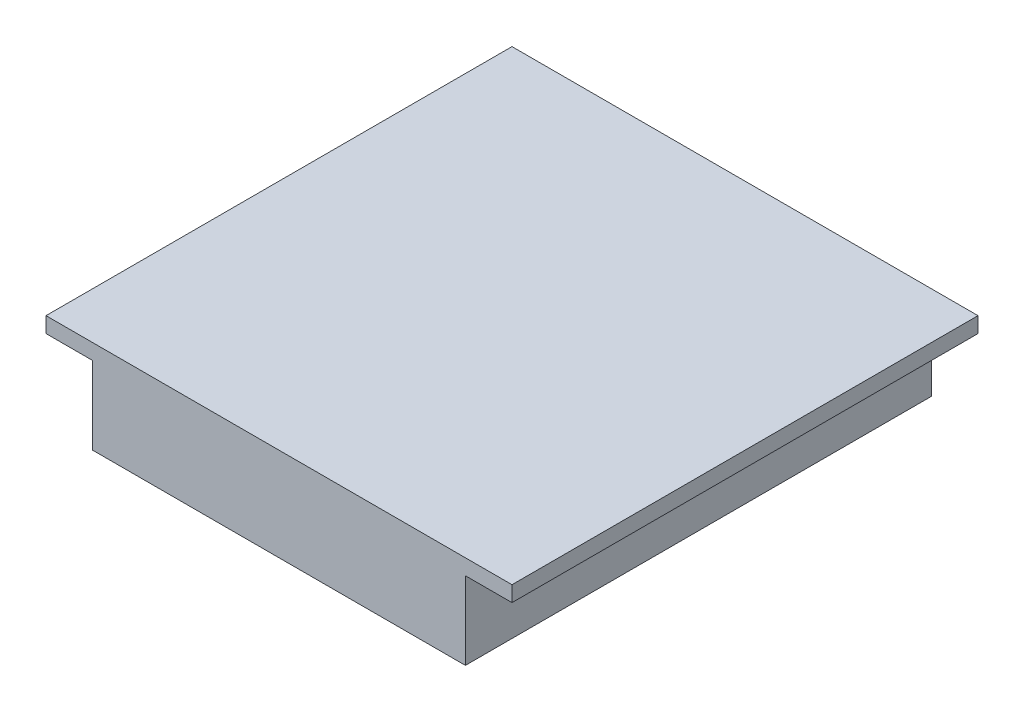
ISO-10303-21;
HEADER;
FILE_DESCRIPTION(('STEP AP214'),'2;1');
FILE_NAME('part.step','',(''),(''),'','','');
FILE_SCHEMA(('AUTOMOTIVE_DESIGN { 1 0 10303 214 1 1 1 1 }'));
ENDSEC;
DATA;
#1=APPLICATION_CONTEXT('core data for automotive mechanical design processes');
#2=APPLICATION_PROTOCOL_DEFINITION('international standard','automotive_design',2000,#1);
#3=PRODUCT_CONTEXT('',#1,'mechanical');
#4=PRODUCT('Part','Part','',(#3));
#5=PRODUCT_RELATED_PRODUCT_CATEGORY('part','',(#4));
#6=PRODUCT_DEFINITION_FORMATION('','',#4);
#7=PRODUCT_DEFINITION_CONTEXT('part definition',#1,'design');
#8=PRODUCT_DEFINITION('design','',#6,#7);
#9=PRODUCT_DEFINITION_SHAPE('','',#8);
#10=(LENGTH_UNIT() NAMED_UNIT(*) SI_UNIT(.MILLI.,.METRE.));
#11=(NAMED_UNIT(*) PLANE_ANGLE_UNIT() SI_UNIT($,.RADIAN.));
#12=(NAMED_UNIT(*) SI_UNIT($,.STERADIAN.) SOLID_ANGLE_UNIT());
#13=UNCERTAINTY_MEASURE_WITH_UNIT(LENGTH_MEASURE(1.E-05),#10,'distance_accuracy_value','');
#14=(GEOMETRIC_REPRESENTATION_CONTEXT(3) GLOBAL_UNCERTAINTY_ASSIGNED_CONTEXT((#13)) GLOBAL_UNIT_ASSIGNED_CONTEXT((#10,
#11,#12)) REPRESENTATION_CONTEXT('',''));
#15=CARTESIAN_POINT('',(0.,0.,0.));
#16=DIRECTION('',(0.,0.,1.));
#17=DIRECTION('',(1.,0.,0.));
#18=AXIS2_PLACEMENT_3D('',#15,#16,#17);
#19=CARTESIAN_POINT('',(-59.5829248938057,25.,150.));
#20=DIRECTION('',(1.,0.,0.));
#21=DIRECTION('',(0.,0.,-1.));
#22=AXIS2_PLACEMENT_3D('',#19,#20,#21);
#23=PLANE('',#22);
#24=DIRECTION('',(0.,-1.,0.));
#25=VECTOR('',#24,1.);
#26=CARTESIAN_POINT('',(-59.5829248938057,25.,0.));
#27=LINE('',#26,#25);
#28=CARTESIAN_POINT('',(-59.5829248938057,30.,0.));
#29=VERTEX_POINT('',#28);
#30=CARTESIAN_POINT('',(-59.5829248938057,25.,0.));
#31=VERTEX_POINT('',#30);
#32=EDGE_CURVE('E129',#29,#31,#27,.T.);
#33=ORIENTED_EDGE('',*,*,#32,.T.);
#34=DIRECTION('',(0.,0.,-1.));
#35=VECTOR('',#34,1.);
#36=CARTESIAN_POINT('',(-59.5829248938057,25.,150.));
#37=LINE('',#36,#35);
#38=CARTESIAN_POINT('',(-59.5829248938057,25.,150.));
#39=VERTEX_POINT('',#38);
#40=EDGE_CURVE('E11',#39,#31,#37,.T.);
#41=ORIENTED_EDGE('',*,*,#40,.F.);
#42=DIRECTION('',(0.,-1.,0.));
#43=VECTOR('',#42,1.);
#44=CARTESIAN_POINT('',(-59.5829248938057,25.,150.));
#45=LINE('',#44,#43);
#46=CARTESIAN_POINT('',(-59.5829248938057,30.,150.));
#47=VERTEX_POINT('',#46);
#48=EDGE_CURVE('E143',#47,#39,#45,.T.);
#49=ORIENTED_EDGE('',*,*,#48,.F.);
#50=DIRECTION('',(0.,0.,-1.));
#51=VECTOR('',#50,1.);
#52=CARTESIAN_POINT('',(-59.5829248938057,30.,150.));
#53=LINE('',#52,#51);
#54=EDGE_CURVE('E125',#47,#29,#53,.T.);
#55=ORIENTED_EDGE('',*,*,#54,.T.);
#56=EDGE_LOOP('',(#33,#41,#49,#55));
#57=FACE_BOUND('',#56,.T.);
#58=ADVANCED_FACE('F33',(#57),#23,.F.);
#59=CARTESIAN_POINT('',(-59.5829248938057,25.,150.));
#60=DIRECTION('',(0.,1.,0.));
#61=DIRECTION('',(0.,0.,1.));
#62=AXIS2_PLACEMENT_3D('',#59,#60,#61);
#63=PLANE('',#62);
#64=DIRECTION('',(1.,0.,0.));
#65=VECTOR('',#64,1.);
#66=CARTESIAN_POINT('',(-59.5829248938057,25.,0.));
#67=LINE('',#66,#65);
#68=CARTESIAN_POINT('',(-44.5829248938057,25.,0.));
#69=VERTEX_POINT('',#68);
#70=EDGE_CURVE('E132',#31,#69,#67,.T.);
#71=ORIENTED_EDGE('',*,*,#70,.T.);
#72=DIRECTION('',(0.,0.,-1.));
#73=VECTOR('',#72,1.);
#74=CARTESIAN_POINT('',(-44.5829248938057,25.,150.));
#75=LINE('',#74,#73);
#76=CARTESIAN_POINT('',(-44.5829248938057,25.,150.));
#77=VERTEX_POINT('',#76);
#78=EDGE_CURVE('E41',#77,#69,#75,.T.);
#79=ORIENTED_EDGE('',*,*,#78,.F.);
#80=DIRECTION('',(1.,0.,0.));
#81=VECTOR('',#80,1.);
#82=CARTESIAN_POINT('',(-59.5829248938057,25.,150.));
#83=LINE('',#82,#81);
#84=EDGE_CURVE('E92',#39,#77,#83,.T.);
#85=ORIENTED_EDGE('',*,*,#84,.F.);
#86=ORIENTED_EDGE('',*,*,#40,.T.);
#87=EDGE_LOOP('',(#71,#79,#85,#86));
#88=FACE_BOUND('',#87,.T.);
#89=ADVANCED_FACE('F178',(#88),#63,.F.);
#90=CARTESIAN_POINT('',(-44.5829248938057,25.,150.));
#91=DIRECTION('',(1.,0.,0.));
#92=DIRECTION('',(0.,0.,-1.));
#93=AXIS2_PLACEMENT_3D('',#90,#91,#92);
#94=PLANE('',#93);
#95=DIRECTION('',(0.,-1.,0.));
#96=VECTOR('',#95,1.);
#97=CARTESIAN_POINT('',(-44.5829248938057,25.,0.));
#98=LINE('',#97,#96);
#99=CARTESIAN_POINT('',(-44.5829248938057,0.,0.));
#100=VERTEX_POINT('',#99);
#101=EDGE_CURVE('E134',#69,#100,#98,.T.);
#102=ORIENTED_EDGE('',*,*,#101,.T.);
#103=DIRECTION('',(0.,0.,-1.));
#104=VECTOR('',#103,1.);
#105=CARTESIAN_POINT('',(-44.5829248938057,0.,150.));
#106=LINE('',#105,#104);
#107=CARTESIAN_POINT('',(-44.5829248938057,0.,150.));
#108=VERTEX_POINT('',#107);
#109=EDGE_CURVE('E150',#108,#100,#106,.T.);
#110=ORIENTED_EDGE('',*,*,#109,.F.);
#111=DIRECTION('',(0.,-1.,0.));
#112=VECTOR('',#111,1.);
#113=CARTESIAN_POINT('',(-44.5829248938057,25.,150.));
#114=LINE('',#113,#112);
#115=EDGE_CURVE('E158',#77,#108,#114,.T.);
#116=ORIENTED_EDGE('',*,*,#115,.F.);
#117=ORIENTED_EDGE('',*,*,#78,.T.);
#118=EDGE_LOOP('',(#102,#110,#116,#117));
#119=FACE_BOUND('',#118,.T.);
#120=ADVANCED_FACE('F156',(#119),#94,.F.);
#121=CARTESIAN_POINT('',(-44.5829248938057,0.,150.));
#122=DIRECTION('',(0.,1.,0.));
#123=DIRECTION('',(0.,0.,1.));
#124=AXIS2_PLACEMENT_3D('',#121,#122,#123);
#125=PLANE('',#124);
#126=DIRECTION('',(1.,0.,0.));
#127=VECTOR('',#126,1.);
#128=CARTESIAN_POINT('',(-44.5829248938057,0.,0.));
#129=LINE('',#128,#127);
#130=CARTESIAN_POINT('',(75.4170751061943,0.,0.));
#131=VERTEX_POINT('',#130);
#132=EDGE_CURVE('E136',#100,#131,#129,.T.);
#133=ORIENTED_EDGE('',*,*,#132,.T.);
#134=DIRECTION('',(0.,0.,-1.));
#135=VECTOR('',#134,1.);
#136=CARTESIAN_POINT('',(75.4170751061943,0.,150.));
#137=LINE('',#136,#135);
#138=CARTESIAN_POINT('',(75.4170751061943,0.,150.));
#139=VERTEX_POINT('',#138);
#140=EDGE_CURVE('E147',#139,#131,#137,.T.);
#141=ORIENTED_EDGE('',*,*,#140,.F.);
#142=DIRECTION('',(1.,0.,0.));
#143=VECTOR('',#142,1.);
#144=CARTESIAN_POINT('',(-44.5829248938057,0.,150.));
#145=LINE('',#144,#143);
#146=EDGE_CURVE('E170',#108,#139,#145,.T.);
#147=ORIENTED_EDGE('',*,*,#146,.F.);
#148=ORIENTED_EDGE('',*,*,#109,.T.);
#149=EDGE_LOOP('',(#133,#141,#147,#148));
#150=FACE_BOUND('',#149,.T.);
#151=ADVANCED_FACE('F166',(#150),#125,.F.);
#152=CARTESIAN_POINT('',(75.4170751061943,0.,150.));
#153=DIRECTION('',(-1.,0.,0.));
#154=DIRECTION('',(0.,0.,1.));
#155=AXIS2_PLACEMENT_3D('',#152,#153,#154);
#156=PLANE('',#155);
#157=DIRECTION('',(0.,1.,0.));
#158=VECTOR('',#157,1.);
#159=CARTESIAN_POINT('',(75.4170751061943,0.,0.));
#160=LINE('',#159,#158);
#161=CARTESIAN_POINT('',(75.4170751061943,25.,0.));
#162=VERTEX_POINT('',#161);
#163=EDGE_CURVE('E138',#131,#162,#160,.T.);
#164=ORIENTED_EDGE('',*,*,#163,.T.);
#165=DIRECTION('',(0.,0.,-1.));
#166=VECTOR('',#165,1.);
#167=CARTESIAN_POINT('',(75.4170751061943,25.,150.));
#168=LINE('',#167,#166);
#169=CARTESIAN_POINT('',(75.4170751061943,25.,150.));
#170=VERTEX_POINT('',#169);
#171=EDGE_CURVE('E120',#170,#162,#168,.T.);
#172=ORIENTED_EDGE('',*,*,#171,.F.);
#173=DIRECTION('',(0.,1.,0.));
#174=VECTOR('',#173,1.);
#175=CARTESIAN_POINT('',(75.4170751061943,0.,150.));
#176=LINE('',#175,#174);
#177=EDGE_CURVE('E111',#139,#170,#176,.T.);
#178=ORIENTED_EDGE('',*,*,#177,.F.);
#179=ORIENTED_EDGE('',*,*,#140,.T.);
#180=EDGE_LOOP('',(#164,#172,#178,#179));
#181=FACE_BOUND('',#180,.T.);
#182=ADVANCED_FACE('F169',(#181),#156,.F.);
#183=CARTESIAN_POINT('',(75.4170751061943,25.,150.));
#184=DIRECTION('',(0.,1.,0.));
#185=DIRECTION('',(0.,0.,1.));
#186=AXIS2_PLACEMENT_3D('',#183,#184,#185);
#187=PLANE('',#186);
#188=DIRECTION('',(1.,0.,0.));
#189=VECTOR('',#188,1.);
#190=CARTESIAN_POINT('',(75.4170751061943,25.,0.));
#191=LINE('',#190,#189);
#192=CARTESIAN_POINT('',(90.4170751061943,25.,0.));
#193=VERTEX_POINT('',#192);
#194=EDGE_CURVE('E119',#162,#193,#191,.T.);
#195=ORIENTED_EDGE('',*,*,#194,.T.);
#196=DIRECTION('',(0.,0.,-1.));
#197=VECTOR('',#196,1.);
#198=CARTESIAN_POINT('',(90.4170751061943,25.,150.));
#199=LINE('',#198,#197);
#200=CARTESIAN_POINT('',(90.4170751061943,25.,150.));
#201=VERTEX_POINT('',#200);
#202=EDGE_CURVE('E116',#201,#193,#199,.T.);
#203=ORIENTED_EDGE('',*,*,#202,.F.);
#204=DIRECTION('',(1.,0.,0.));
#205=VECTOR('',#204,1.);
#206=CARTESIAN_POINT('',(75.4170751061943,25.,150.));
#207=LINE('',#206,#205);
#208=EDGE_CURVE('E105',#170,#201,#207,.T.);
#209=ORIENTED_EDGE('',*,*,#208,.F.);
#210=ORIENTED_EDGE('',*,*,#171,.T.);
#211=EDGE_LOOP('',(#195,#203,#209,#210));
#212=FACE_BOUND('',#211,.T.);
#213=ADVANCED_FACE('F117',(#212),#187,.F.);
#214=CARTESIAN_POINT('',(90.4170751061943,30.,150.));
#215=DIRECTION('',(-1.,0.,0.));
#216=DIRECTION('',(0.,-1.,0.));
#217=AXIS2_PLACEMENT_3D('',#214,#215,#216);
#218=PLANE('',#217);
#219=DIRECTION('',(0.,1.,0.));
#220=VECTOR('',#219,1.);
#221=CARTESIAN_POINT('',(90.4170751061943,30.,0.));
#222=LINE('',#221,#220);
#223=CARTESIAN_POINT('',(90.4170751061943,30.,0.));
#224=VERTEX_POINT('',#223);
#225=EDGE_CURVE('E78',#193,#224,#222,.T.);
#226=ORIENTED_EDGE('',*,*,#225,.T.);
#227=DIRECTION('',(0.,0.,-1.));
#228=VECTOR('',#227,1.);
#229=CARTESIAN_POINT('',(90.4170751061943,30.,150.));
#230=LINE('',#229,#228);
#231=CARTESIAN_POINT('',(90.4170751061943,30.,150.));
#232=VERTEX_POINT('',#231);
#233=EDGE_CURVE('E121',#232,#224,#230,.T.);
#234=ORIENTED_EDGE('',*,*,#233,.F.);
#235=DIRECTION('',(0.,1.,0.));
#236=VECTOR('',#235,1.);
#237=CARTESIAN_POINT('',(90.4170751061943,30.,150.));
#238=LINE('',#237,#236);
#239=EDGE_CURVE('E109',#201,#232,#238,.T.);
#240=ORIENTED_EDGE('',*,*,#239,.F.);
#241=ORIENTED_EDGE('',*,*,#202,.T.);
#242=EDGE_LOOP('',(#226,#234,#240,#241));
#243=FACE_BOUND('',#242,.T.);
#244=ADVANCED_FACE('F123',(#243),#218,.F.);
#245=CARTESIAN_POINT('',(-59.5829248938057,30.,150.));
#246=DIRECTION('',(0.,-1.,0.));
#247=DIRECTION('',(0.,0.,-1.));
#248=AXIS2_PLACEMENT_3D('',#245,#246,#247);
#249=PLANE('',#248);
#250=DIRECTION('',(-1.,0.,0.));
#251=VECTOR('',#250,1.);
#252=CARTESIAN_POINT('',(-59.5829248938057,30.,0.));
#253=LINE('',#252,#251);
#254=EDGE_CURVE('E84',#224,#29,#253,.T.);
#255=ORIENTED_EDGE('',*,*,#254,.T.);
#256=ORIENTED_EDGE('',*,*,#54,.F.);
#257=DIRECTION('',(-1.,0.,0.));
#258=VECTOR('',#257,1.);
#259=CARTESIAN_POINT('',(-59.5829248938057,30.,150.));
#260=LINE('',#259,#258);
#261=EDGE_CURVE('E49',#232,#47,#260,.T.);
#262=ORIENTED_EDGE('',*,*,#261,.F.);
#263=ORIENTED_EDGE('',*,*,#233,.T.);
#264=EDGE_LOOP('',(#255,#256,#262,#263));
#265=FACE_BOUND('',#264,.T.);
#266=ADVANCED_FACE('F194',(#265),#249,.F.);
#267=CARTESIAN_POINT('',(0.,0.,150.));
#268=DIRECTION('',(0.,0.,-1.));
#269=DIRECTION('',(-1.,0.,0.));
#270=AXIS2_PLACEMENT_3D('',#267,#268,#269);
#271=PLANE('',#270);
#272=ORIENTED_EDGE('',*,*,#48,.T.);
#273=ORIENTED_EDGE('',*,*,#84,.T.);
#274=ORIENTED_EDGE('',*,*,#115,.T.);
#275=ORIENTED_EDGE('',*,*,#146,.T.);
#276=ORIENTED_EDGE('',*,*,#177,.T.);
#277=ORIENTED_EDGE('',*,*,#208,.T.);
#278=ORIENTED_EDGE('',*,*,#239,.T.);
#279=ORIENTED_EDGE('',*,*,#261,.T.);
#280=EDGE_LOOP('',(#272,#273,#274,#275,#276,#277,#278,#279));
#281=FACE_BOUND('',#280,.T.);
#282=ADVANCED_FACE('F107',(#281),#271,.F.);
#283=CARTESIAN_POINT('',(0.,0.,0.));
#284=DIRECTION('',(0.,0.,-1.));
#285=DIRECTION('',(-1.,0.,0.));
#286=AXIS2_PLACEMENT_3D('',#283,#284,#285);
#287=PLANE('',#286);
#288=ORIENTED_EDGE('',*,*,#32,.F.);
#289=ORIENTED_EDGE('',*,*,#254,.F.);
#290=ORIENTED_EDGE('',*,*,#225,.F.);
#291=ORIENTED_EDGE('',*,*,#194,.F.);
#292=ORIENTED_EDGE('',*,*,#163,.F.);
#293=ORIENTED_EDGE('',*,*,#132,.F.);
#294=ORIENTED_EDGE('',*,*,#101,.F.);
#295=ORIENTED_EDGE('',*,*,#70,.F.);
#296=EDGE_LOOP('',(#288,#289,#290,#291,#292,#293,#294,#295));
#297=FACE_BOUND('',#296,.T.);
#298=ADVANCED_FACE('F162',(#297),#287,.T.);
#299=CLOSED_SHELL('',(#58,#89,#120,#151,#182,#213,#244,#266,#282,#298));
#300=MANIFOLD_SOLID_BREP('B2',#299);
#301=ADVANCED_BREP_SHAPE_REPRESENTATION('',(#18,#300),#14);
#302=SHAPE_DEFINITION_REPRESENTATION(#9,#301);
ENDSEC;
END-ISO-10303-21;
